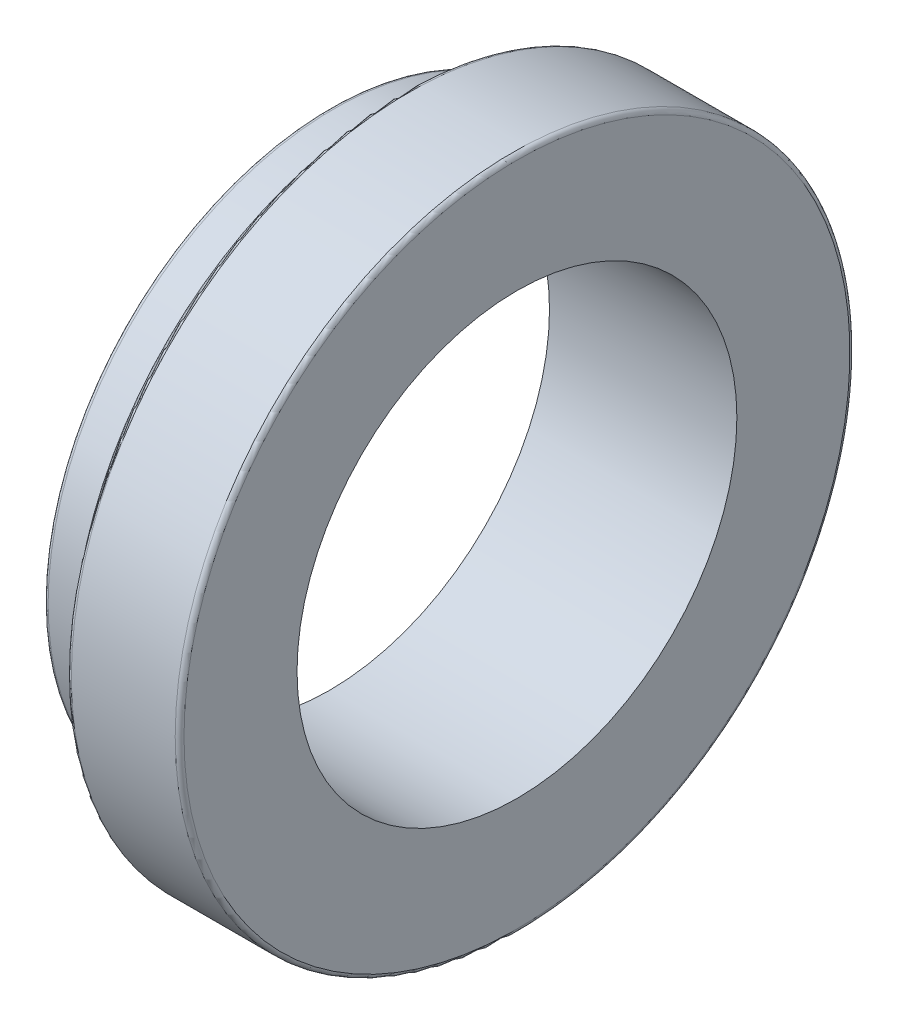
ISO-10303-21;
HEADER;
FILE_DESCRIPTION(('STEP AP214'),'2;1');
FILE_NAME('part.step','',(''),(''),'','','');
FILE_SCHEMA(('AUTOMOTIVE_DESIGN { 1 0 10303 214 1 1 1 1 }'));
ENDSEC;
DATA;
#1=APPLICATION_CONTEXT('core data for automotive mechanical design processes');
#2=APPLICATION_PROTOCOL_DEFINITION('international standard','automotive_design',2000,#1);
#3=PRODUCT_CONTEXT('',#1,'mechanical');
#4=PRODUCT('Part','Part','',(#3));
#5=PRODUCT_RELATED_PRODUCT_CATEGORY('part','',(#4));
#6=PRODUCT_DEFINITION_FORMATION('','',#4);
#7=PRODUCT_DEFINITION_CONTEXT('part definition',#1,'design');
#8=PRODUCT_DEFINITION('design','',#6,#7);
#9=PRODUCT_DEFINITION_SHAPE('','',#8);
#10=(LENGTH_UNIT() NAMED_UNIT(*) SI_UNIT(.MILLI.,.METRE.));
#11=(NAMED_UNIT(*) PLANE_ANGLE_UNIT() SI_UNIT($,.RADIAN.));
#12=(NAMED_UNIT(*) SI_UNIT($,.STERADIAN.) SOLID_ANGLE_UNIT());
#13=UNCERTAINTY_MEASURE_WITH_UNIT(LENGTH_MEASURE(1.E-05),#10,'distance_accuracy_value','');
#14=(GEOMETRIC_REPRESENTATION_CONTEXT(3) GLOBAL_UNCERTAINTY_ASSIGNED_CONTEXT((#13)) GLOBAL_UNIT_ASSIGNED_CONTEXT((#10,
#11,#12)) REPRESENTATION_CONTEXT('',''));
#15=CARTESIAN_POINT('',(0.,0.,0.));
#16=DIRECTION('',(0.,0.,1.));
#17=DIRECTION('',(1.,0.,0.));
#18=AXIS2_PLACEMENT_3D('',#15,#16,#17);
#19=CARTESIAN_POINT('',(0.,0.,0.));
#20=DIRECTION('',(-1.,0.,0.));
#21=DIRECTION('',(0.,0.,1.));
#22=AXIS2_PLACEMENT_3D('',#19,#20,#21);
#23=CYLINDRICAL_SURFACE('',#22,31.75);
#24=CARTESIAN_POINT('',(28.8469461891185,0.,0.));
#25=DIRECTION('',(-1.,0.,0.));
#26=DIRECTION('',(0.,0.,1.));
#27=AXIS2_PLACEMENT_3D('',#24,#25,#26);
#28=CIRCLE('',#27,31.75);
#29=CARTESIAN_POINT('',(28.8469461891185,0.,31.75));
#30=VERTEX_POINT('',#29);
#31=EDGE_CURVE('E78',#30,#30,#28,.T.);
#32=ORIENTED_EDGE('',*,*,#31,.F.);
#33=EDGE_LOOP('',(#32));
#34=FACE_BOUND('',#33,.T.);
#35=CARTESIAN_POINT('',(1.79594618911854,0.,0.));
#36=DIRECTION('',(-1.,0.,0.));
#37=DIRECTION('',(0.,0.,1.));
#38=AXIS2_PLACEMENT_3D('',#35,#36,#37);
#39=CIRCLE('',#38,31.75);
#40=CARTESIAN_POINT('',(1.79594618911854,0.,31.75));
#41=VERTEX_POINT('',#40);
#42=EDGE_CURVE('E10',#41,#41,#39,.T.);
#43=ORIENTED_EDGE('',*,*,#42,.T.);
#44=EDGE_LOOP('',(#43));
#45=FACE_BOUND('',#44,.T.);
#46=ADVANCED_FACE('F35',(#34,#45),#23,.F.);
#47=CARTESIAN_POINT('',(1.79594618911854,31.75,0.));
#48=DIRECTION('',(1.,0.,0.));
#49=DIRECTION('',(0.,0.,-1.));
#50=AXIS2_PLACEMENT_3D('',#47,#48,#49);
#51=PLANE('',#50);
#52=ORIENTED_EDGE('',*,*,#42,.F.);
#53=EDGE_LOOP('',(#52));
#54=FACE_BOUND('',#53,.T.);
#55=CARTESIAN_POINT('',(1.79594618911854,0.,0.));
#56=DIRECTION('',(-1.,0.,0.));
#57=DIRECTION('',(0.,0.,1.));
#58=AXIS2_PLACEMENT_3D('',#55,#56,#57);
#59=CIRCLE('',#58,40.64);
#60=CARTESIAN_POINT('',(1.79594618911854,0.,40.64));
#61=VERTEX_POINT('',#60);
#62=EDGE_CURVE('E41',#61,#61,#59,.T.);
#63=ORIENTED_EDGE('',*,*,#62,.T.);
#64=EDGE_LOOP('',(#63));
#65=FACE_BOUND('',#64,.T.);
#66=ADVANCED_FACE('F85',(#54,#65),#51,.F.);
#67=CARTESIAN_POINT('',(2.43094618911854,0.,0.));
#68=DIRECTION('',(-1.,0.,0.));
#69=DIRECTION('',(0.,0.,1.));
#70=AXIS2_PLACEMENT_3D('',#67,#68,#69);
#71=TOROIDAL_SURFACE('',#70,40.64,0.634999999999998);
#72=ORIENTED_EDGE('',*,*,#62,.F.);
#73=EDGE_LOOP('',(#72));
#74=FACE_BOUND('',#73,.T.);
#75=CARTESIAN_POINT('',(2.43094618911854,0.,0.));
#76=DIRECTION('',(-1.,0.,0.));
#77=DIRECTION('',(0.,0.,1.));
#78=AXIS2_PLACEMENT_3D('',#75,#76,#77);
#79=CIRCLE('',#78,41.275);
#80=CARTESIAN_POINT('',(2.43094618911854,0.,41.275));
#81=VERTEX_POINT('',#80);
#82=EDGE_CURVE('E45',#81,#81,#79,.T.);
#83=ORIENTED_EDGE('',*,*,#82,.T.);
#84=EDGE_LOOP('',(#83));
#85=FACE_BOUND('',#84,.T.);
#86=ADVANCED_FACE('F89',(#74,#85),#71,.T.);
#87=CARTESIAN_POINT('',(0.,0.,0.));
#88=DIRECTION('',(-1.,0.,0.));
#89=DIRECTION('',(0.,0.,1.));
#90=AXIS2_PLACEMENT_3D('',#87,#88,#89);
#91=CYLINDRICAL_SURFACE('',#90,41.275);
#92=ORIENTED_EDGE('',*,*,#82,.F.);
#93=EDGE_LOOP('',(#92));
#94=FACE_BOUND('',#93,.T.);
#95=CARTESIAN_POINT('',(10.6859461891185,0.,0.));
#96=DIRECTION('',(-1.,0.,0.));
#97=DIRECTION('',(0.,0.,1.));
#98=AXIS2_PLACEMENT_3D('',#95,#96,#97);
#99=CIRCLE('',#98,41.275);
#100=CARTESIAN_POINT('',(10.6859461891185,0.,41.275));
#101=VERTEX_POINT('',#100);
#102=EDGE_CURVE('E49',#101,#101,#99,.T.);
#103=ORIENTED_EDGE('',*,*,#102,.T.);
#104=EDGE_LOOP('',(#103));
#105=FACE_BOUND('',#104,.T.);
#106=ADVANCED_FACE('F94',(#94,#105),#91,.T.);
#107=CARTESIAN_POINT('',(10.6859461891185,45.7835,0.));
#108=DIRECTION('',(1.,0.,0.));
#109=DIRECTION('',(0.,0.,-1.));
#110=AXIS2_PLACEMENT_3D('',#107,#108,#109);
#111=PLANE('',#110);
#112=ORIENTED_EDGE('',*,*,#102,.F.);
#113=EDGE_LOOP('',(#112));
#114=FACE_BOUND('',#113,.T.);
#115=CARTESIAN_POINT('',(10.6859461891185,0.,0.));
#116=DIRECTION('',(-1.,0.,0.));
#117=DIRECTION('',(0.,0.,1.));
#118=AXIS2_PLACEMENT_3D('',#115,#116,#117);
#119=CIRCLE('',#118,45.7835);
#120=CARTESIAN_POINT('',(10.6859461891185,0.,45.7835));
#121=VERTEX_POINT('',#120);
#122=EDGE_CURVE('E54',#121,#121,#119,.T.);
#123=ORIENTED_EDGE('',*,*,#122,.T.);
#124=EDGE_LOOP('',(#123));
#125=FACE_BOUND('',#124,.T.);
#126=ADVANCED_FACE('F100',(#114,#125),#111,.F.);
#127=CARTESIAN_POINT('',(10.9399461891185,0.,0.));
#128=DIRECTION('',(-1.,0.,0.));
#129=DIRECTION('',(0.,0.,1.));
#130=AXIS2_PLACEMENT_3D('',#127,#128,#129);
#131=TOROIDAL_SURFACE('',#130,45.7835,0.254000000000003);
#132=ORIENTED_EDGE('',*,*,#122,.F.);
#133=EDGE_LOOP('',(#132));
#134=FACE_BOUND('',#133,.T.);
#135=CARTESIAN_POINT('',(10.9399461891185,0.,0.));
#136=DIRECTION('',(-1.,0.,0.));
#137=DIRECTION('',(0.,0.,1.));
#138=AXIS2_PLACEMENT_3D('',#135,#136,#137);
#139=CIRCLE('',#138,46.0375);
#140=CARTESIAN_POINT('',(10.9399461891185,0.,46.0375));
#141=VERTEX_POINT('',#140);
#142=EDGE_CURVE('E57',#141,#141,#139,.T.);
#143=ORIENTED_EDGE('',*,*,#142,.T.);
#144=EDGE_LOOP('',(#143));
#145=FACE_BOUND('',#144,.T.);
#146=ADVANCED_FACE('F104',(#134,#145),#131,.T.);
#147=CARTESIAN_POINT('',(0.,0.,0.));
#148=DIRECTION('',(-1.,0.,0.));
#149=DIRECTION('',(0.,0.,1.));
#150=AXIS2_PLACEMENT_3D('',#147,#148,#149);
#151=CYLINDRICAL_SURFACE('',#150,46.0375);
#152=ORIENTED_EDGE('',*,*,#142,.F.);
#153=EDGE_LOOP('',(#152));
#154=FACE_BOUND('',#153,.T.);
#155=CARTESIAN_POINT('',(12.3247488679992,0.,0.));
#156=DIRECTION('',(-1.,0.,0.));
#157=DIRECTION('',(0.,0.,1.));
#158=AXIS2_PLACEMENT_3D('',#155,#156,#157);
#159=CIRCLE('',#158,46.0375);
#160=CARTESIAN_POINT('',(12.3247488679992,0.,46.0375));
#161=VERTEX_POINT('',#160);
#162=EDGE_CURVE('E60',#161,#161,#159,.T.);
#163=ORIENTED_EDGE('',*,*,#162,.T.);
#164=EDGE_LOOP('',(#163));
#165=FACE_BOUND('',#164,.T.);
#166=ADVANCED_FACE('F108',(#154,#165),#151,.T.);
#167=CARTESIAN_POINT('',(12.3247488679992,0.,0.));
#168=DIRECTION('',(-1.,0.,0.));
#169=DIRECTION('',(0.,0.,1.));
#170=AXIS2_PLACEMENT_3D('',#167,#168,#169);
#171=TOROIDAL_SURFACE('',#170,46.2915,0.253999999999999);
#172=ORIENTED_EDGE('',*,*,#162,.F.);
#173=EDGE_LOOP('',(#172));
#174=FACE_BOUND('',#173,.T.);
#175=CARTESIAN_POINT('',(12.5787488679992,0.,0.));
#176=DIRECTION('',(-1.,0.,0.));
#177=DIRECTION('',(0.,0.,1.));
#178=AXIS2_PLACEMENT_3D('',#175,#176,#177);
#179=CIRCLE('',#178,46.2915);
#180=CARTESIAN_POINT('',(12.5787488679992,0.,46.2915));
#181=VERTEX_POINT('',#180);
#182=EDGE_CURVE('E63',#181,#181,#179,.T.);
#183=ORIENTED_EDGE('',*,*,#182,.T.);
#184=EDGE_LOOP('',(#183));
#185=FACE_BOUND('',#184,.T.);
#186=ADVANCED_FACE('F112',(#174,#185),#171,.F.);
#187=CARTESIAN_POINT('',(12.5787488679992,46.2915,0.));
#188=DIRECTION('',(1.,0.,0.));
#189=DIRECTION('',(0.,0.,-1.));
#190=AXIS2_PLACEMENT_3D('',#187,#188,#189);
#191=PLANE('',#190);
#192=ORIENTED_EDGE('',*,*,#182,.F.);
#193=EDGE_LOOP('',(#192));
#194=FACE_BOUND('',#193,.T.);
#195=CARTESIAN_POINT('',(12.5787488679992,0.,0.));
#196=DIRECTION('',(-1.,0.,0.));
#197=DIRECTION('',(0.,0.,1.));
#198=AXIS2_PLACEMENT_3D('',#195,#196,#197);
#199=CIRCLE('',#198,48.0695);
#200=CARTESIAN_POINT('',(12.5787488679992,0.,48.0695));
#201=VERTEX_POINT('',#200);
#202=EDGE_CURVE('E66',#201,#201,#199,.T.);
#203=ORIENTED_EDGE('',*,*,#202,.T.);
#204=EDGE_LOOP('',(#203));
#205=FACE_BOUND('',#204,.T.);
#206=ADVANCED_FACE('F116',(#194,#205),#191,.F.);
#207=CARTESIAN_POINT('',(13.2137488679992,0.,0.));
#208=DIRECTION('',(-1.,0.,0.));
#209=DIRECTION('',(0.,0.,1.));
#210=AXIS2_PLACEMENT_3D('',#207,#208,#209);
#211=TOROIDAL_SURFACE('',#210,48.0695,0.634999999999996);
#212=ORIENTED_EDGE('',*,*,#202,.F.);
#213=EDGE_LOOP('',(#212));
#214=FACE_BOUND('',#213,.T.);
#215=CARTESIAN_POINT('',(13.2137488679992,0.,0.));
#216=DIRECTION('',(-1.,0.,0.));
#217=DIRECTION('',(0.,0.,1.));
#218=AXIS2_PLACEMENT_3D('',#215,#216,#217);
#219=CIRCLE('',#218,48.7045);
#220=CARTESIAN_POINT('',(13.2137488679992,0.,48.7045));
#221=VERTEX_POINT('',#220);
#222=EDGE_CURVE('E69',#221,#221,#219,.T.);
#223=ORIENTED_EDGE('',*,*,#222,.T.);
#224=EDGE_LOOP('',(#223));
#225=FACE_BOUND('',#224,.T.);
#226=ADVANCED_FACE('F120',(#214,#225),#211,.T.);
#227=CARTESIAN_POINT('',(0.,0.,0.));
#228=DIRECTION('',(-1.,0.,0.));
#229=DIRECTION('',(0.,0.,1.));
#230=AXIS2_PLACEMENT_3D('',#227,#228,#229);
#231=CYLINDRICAL_SURFACE('',#230,48.7045);
#232=ORIENTED_EDGE('',*,*,#222,.F.);
#233=EDGE_LOOP('',(#232));
#234=FACE_BOUND('',#233,.T.);
#235=CARTESIAN_POINT('',(28.2119461891185,0.,0.));
#236=DIRECTION('',(-1.,0.,0.));
#237=DIRECTION('',(0.,0.,1.));
#238=AXIS2_PLACEMENT_3D('',#235,#236,#237);
#239=CIRCLE('',#238,48.7045);
#240=CARTESIAN_POINT('',(28.2119461891185,0.,48.7045));
#241=VERTEX_POINT('',#240);
#242=EDGE_CURVE('E72',#241,#241,#239,.T.);
#243=ORIENTED_EDGE('',*,*,#242,.T.);
#244=EDGE_LOOP('',(#243));
#245=FACE_BOUND('',#244,.T.);
#246=ADVANCED_FACE('F124',(#234,#245),#231,.T.);
#247=CARTESIAN_POINT('',(28.2119461891185,0.,0.));
#248=DIRECTION('',(-1.,0.,0.));
#249=DIRECTION('',(0.,0.,1.));
#250=AXIS2_PLACEMENT_3D('',#247,#248,#249);
#251=TOROIDAL_SURFACE('',#250,48.0695,0.634999999999998);
#252=ORIENTED_EDGE('',*,*,#242,.F.);
#253=EDGE_LOOP('',(#252));
#254=FACE_BOUND('',#253,.T.);
#255=CARTESIAN_POINT('',(28.8469461891185,0.,0.));
#256=DIRECTION('',(-1.,0.,0.));
#257=DIRECTION('',(0.,0.,1.));
#258=AXIS2_PLACEMENT_3D('',#255,#256,#257);
#259=CIRCLE('',#258,48.0695);
#260=CARTESIAN_POINT('',(28.8469461891185,0.,48.0695));
#261=VERTEX_POINT('',#260);
#262=EDGE_CURVE('E75',#261,#261,#259,.T.);
#263=ORIENTED_EDGE('',*,*,#262,.T.);
#264=EDGE_LOOP('',(#263));
#265=FACE_BOUND('',#264,.T.);
#266=ADVANCED_FACE('F128',(#254,#265),#251,.T.);
#267=CARTESIAN_POINT('',(28.8469461891185,48.0695,0.));
#268=DIRECTION('',(-1.,0.,0.));
#269=DIRECTION('',(0.,0.,1.));
#270=AXIS2_PLACEMENT_3D('',#267,#268,#269);
#271=PLANE('',#270);
#272=ORIENTED_EDGE('',*,*,#262,.F.);
#273=EDGE_LOOP('',(#272));
#274=FACE_BOUND('',#273,.T.);
#275=ORIENTED_EDGE('',*,*,#31,.T.);
#276=EDGE_LOOP('',(#275));
#277=FACE_BOUND('',#276,.T.);
#278=ADVANCED_FACE('F82',(#274,#277),#271,.F.);
#279=CLOSED_SHELL('',(#46,#66,#86,#106,#126,#146,#166,#186,#206,#226,#246,#266,#278));
#280=MANIFOLD_SOLID_BREP('B2',#279);
#281=ADVANCED_BREP_SHAPE_REPRESENTATION('',(#18,#280),#14);
#282=SHAPE_DEFINITION_REPRESENTATION(#9,#281);
ENDSEC;
END-ISO-10303-21;
